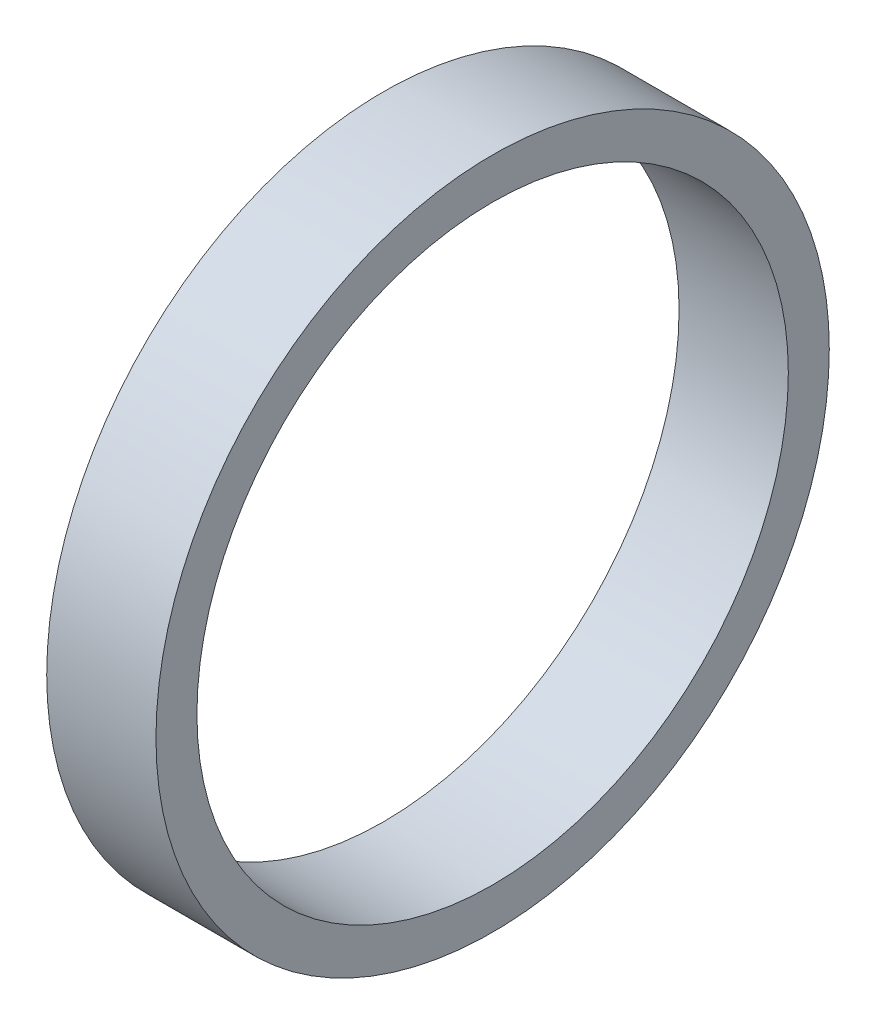
ISO-10303-21;
HEADER;
FILE_DESCRIPTION(('STEP AP214'),'2;1');
FILE_NAME('part.step','',(''),(''),'','','');
FILE_SCHEMA(('AUTOMOTIVE_DESIGN { 1 0 10303 214 1 1 1 1 }'));
ENDSEC;
DATA;
#1=APPLICATION_CONTEXT('core data for automotive mechanical design processes');
#2=APPLICATION_PROTOCOL_DEFINITION('international standard','automotive_design',2000,#1);
#3=PRODUCT_CONTEXT('',#1,'mechanical');
#4=PRODUCT('Part','Part','',(#3));
#5=PRODUCT_RELATED_PRODUCT_CATEGORY('part','',(#4));
#6=PRODUCT_DEFINITION_FORMATION('','',#4);
#7=PRODUCT_DEFINITION_CONTEXT('part definition',#1,'design');
#8=PRODUCT_DEFINITION('design','',#6,#7);
#9=PRODUCT_DEFINITION_SHAPE('','',#8);
#10=(LENGTH_UNIT() NAMED_UNIT(*) SI_UNIT(.MILLI.,.METRE.));
#11=(NAMED_UNIT(*) PLANE_ANGLE_UNIT() SI_UNIT($,.RADIAN.));
#12=(NAMED_UNIT(*) SI_UNIT($,.STERADIAN.) SOLID_ANGLE_UNIT());
#13=UNCERTAINTY_MEASURE_WITH_UNIT(LENGTH_MEASURE(1.E-05),#10,'distance_accuracy_value','');
#14=(GEOMETRIC_REPRESENTATION_CONTEXT(3) GLOBAL_UNCERTAINTY_ASSIGNED_CONTEXT((#13)) GLOBAL_UNIT_ASSIGNED_CONTEXT((#10,
#11,#12)) REPRESENTATION_CONTEXT('',''));
#15=CARTESIAN_POINT('',(0.,0.,0.));
#16=DIRECTION('',(0.,0.,1.));
#17=DIRECTION('',(1.,0.,0.));
#18=AXIS2_PLACEMENT_3D('',#15,#16,#17);
#19=CARTESIAN_POINT('',(2.032,0.,0.));
#20=DIRECTION('',(1.,0.,0.));
#21=DIRECTION('',(0.,0.,-1.));
#22=AXIS2_PLACEMENT_3D('',#19,#20,#21);
#23=PLANE('',#22);
#24=CARTESIAN_POINT('',(2.032,0.,0.));
#25=DIRECTION('',(1.,0.,0.));
#26=DIRECTION('',(0.,0.,-1.));
#27=AXIS2_PLACEMENT_3D('',#24,#25,#26);
#28=CIRCLE('',#27,6.262000049);
#29=CARTESIAN_POINT('',(2.032,0.,-6.262000049));
#30=VERTEX_POINT('',#29);
#31=EDGE_CURVE('E10',#30,#30,#28,.T.);
#32=ORIENTED_EDGE('',*,*,#31,.T.);
#33=EDGE_LOOP('',(#32));
#34=FACE_BOUND('',#33,.T.);
#35=CARTESIAN_POINT('',(2.032,0.,0.));
#36=DIRECTION('',(1.,0.,0.));
#37=DIRECTION('',(0.,0.,-1.));
#38=AXIS2_PLACEMENT_3D('',#35,#36,#37);
#39=CIRCLE('',#38,5.500000049);
#40=CARTESIAN_POINT('',(2.032,0.,-5.500000049));
#41=VERTEX_POINT('',#40);
#42=EDGE_CURVE('E48',#41,#41,#39,.T.);
#43=ORIENTED_EDGE('',*,*,#42,.F.);
#44=EDGE_LOOP('',(#43));
#45=FACE_BOUND('',#44,.T.);
#46=ADVANCED_FACE('F37',(#34,#45),#23,.T.);
#47=CARTESIAN_POINT('',(0.,0.,0.));
#48=DIRECTION('',(1.,0.,0.));
#49=DIRECTION('',(0.,0.,-1.));
#50=AXIS2_PLACEMENT_3D('',#47,#48,#49);
#51=PLANE('',#50);
#52=CARTESIAN_POINT('',(0.,0.,0.));
#53=DIRECTION('',(1.,0.,0.));
#54=DIRECTION('',(0.,0.,-1.));
#55=AXIS2_PLACEMENT_3D('',#52,#53,#54);
#56=CIRCLE('',#55,6.262000049);
#57=CARTESIAN_POINT('',(0.,0.,-6.262000049));
#58=VERTEX_POINT('',#57);
#59=EDGE_CURVE('E41',#58,#58,#56,.T.);
#60=ORIENTED_EDGE('',*,*,#59,.F.);
#61=EDGE_LOOP('',(#60));
#62=FACE_BOUND('',#61,.T.);
#63=CARTESIAN_POINT('',(0.,0.,0.));
#64=DIRECTION('',(1.,0.,0.));
#65=DIRECTION('',(0.,0.,-1.));
#66=AXIS2_PLACEMENT_3D('',#63,#64,#65);
#67=CIRCLE('',#66,5.500000049);
#68=CARTESIAN_POINT('',(0.,0.,-5.500000049));
#69=VERTEX_POINT('',#68);
#70=EDGE_CURVE('E50',#69,#69,#67,.T.);
#71=ORIENTED_EDGE('',*,*,#70,.T.);
#72=EDGE_LOOP('',(#71));
#73=FACE_BOUND('',#72,.T.);
#74=ADVANCED_FACE('F60',(#62,#73),#51,.F.);
#75=CARTESIAN_POINT('',(2.032,0.,0.));
#76=DIRECTION('',(-1.,0.,0.));
#77=DIRECTION('',(0.,0.,1.));
#78=AXIS2_PLACEMENT_3D('',#75,#76,#77);
#79=CYLINDRICAL_SURFACE('',#78,6.262000049);
#80=ORIENTED_EDGE('',*,*,#31,.F.);
#81=EDGE_LOOP('',(#80));
#82=FACE_BOUND('',#81,.T.);
#83=ORIENTED_EDGE('',*,*,#59,.T.);
#84=EDGE_LOOP('',(#83));
#85=FACE_BOUND('',#84,.T.);
#86=ADVANCED_FACE('F39',(#82,#85),#79,.T.);
#87=CARTESIAN_POINT('',(2.032,0.,0.));
#88=DIRECTION('',(-1.,0.,0.));
#89=DIRECTION('',(0.,0.,1.));
#90=AXIS2_PLACEMENT_3D('',#87,#88,#89);
#91=CYLINDRICAL_SURFACE('',#90,5.500000049);
#92=ORIENTED_EDGE('',*,*,#42,.T.);
#93=EDGE_LOOP('',(#92));
#94=FACE_BOUND('',#93,.T.);
#95=ORIENTED_EDGE('',*,*,#70,.F.);
#96=EDGE_LOOP('',(#95));
#97=FACE_BOUND('',#96,.T.);
#98=ADVANCED_FACE('F56',(#94,#97),#91,.F.);
#99=CLOSED_SHELL('',(#46,#74,#86,#98));
#100=MANIFOLD_SOLID_BREP('B2',#99);
#101=ADVANCED_BREP_SHAPE_REPRESENTATION('',(#18,#100),#14);
#102=SHAPE_DEFINITION_REPRESENTATION(#9,#101);
ENDSEC;
END-ISO-10303-21;
